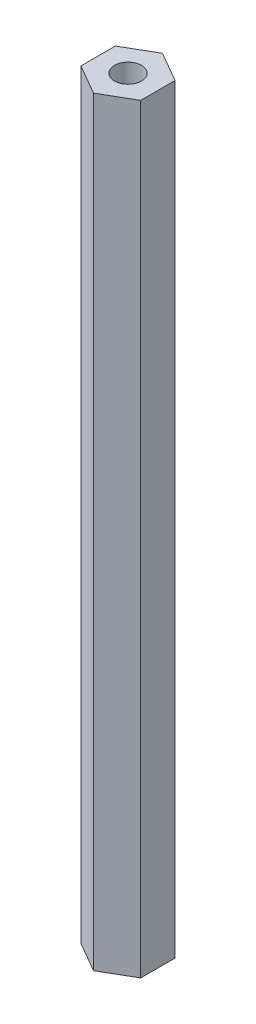
ISO-10303-21;
HEADER;
FILE_DESCRIPTION(('STEP AP214'),'2;1');
FILE_NAME('part.step','',(''),(''),'','','');
FILE_SCHEMA(('AUTOMOTIVE_DESIGN { 1 0 10303 214 1 1 1 1 }'));
ENDSEC;
DATA;
#1=APPLICATION_CONTEXT('core data for automotive mechanical design processes');
#2=APPLICATION_PROTOCOL_DEFINITION('international standard','automotive_design',2000,#1);
#3=PRODUCT_CONTEXT('',#1,'mechanical');
#4=PRODUCT('Part','Part','',(#3));
#5=PRODUCT_RELATED_PRODUCT_CATEGORY('part','',(#4));
#6=PRODUCT_DEFINITION_FORMATION('','',#4);
#7=PRODUCT_DEFINITION_CONTEXT('part definition',#1,'design');
#8=PRODUCT_DEFINITION('design','',#6,#7);
#9=PRODUCT_DEFINITION_SHAPE('','',#8);
#10=(LENGTH_UNIT() NAMED_UNIT(*) SI_UNIT(.MILLI.,.METRE.));
#11=(NAMED_UNIT(*) PLANE_ANGLE_UNIT() SI_UNIT($,.RADIAN.));
#12=(NAMED_UNIT(*) SI_UNIT($,.STERADIAN.) SOLID_ANGLE_UNIT());
#13=UNCERTAINTY_MEASURE_WITH_UNIT(LENGTH_MEASURE(1.E-05),#10,'distance_accuracy_value','');
#14=(GEOMETRIC_REPRESENTATION_CONTEXT(3) GLOBAL_UNCERTAINTY_ASSIGNED_CONTEXT((#13)) GLOBAL_UNIT_ASSIGNED_CONTEXT((#10,
#11,#12)) REPRESENTATION_CONTEXT('',''));
#15=CARTESIAN_POINT('',(0.,0.,0.));
#16=DIRECTION('',(0.,0.,1.));
#17=DIRECTION('',(1.,0.,0.));
#18=AXIS2_PLACEMENT_3D('',#15,#16,#17);
#19=CARTESIAN_POINT('',(0.,70.,-3.17542648054294));
#20=DIRECTION('',(0.5,0.,0.866025403784439));
#21=DIRECTION('',(0.866025403784439,0.,-0.5));
#22=AXIS2_PLACEMENT_3D('',#19,#20,#21);
#23=PLANE('',#22);
#24=DIRECTION('',(-0.866025403784439,0.,0.5));
#25=VECTOR('',#24,1.);
#26=CARTESIAN_POINT('',(0.,0.,-3.17542648054294));
#27=LINE('',#26,#25);
#28=CARTESIAN_POINT('',(0.,0.,-3.17542648054294));
#29=VERTEX_POINT('',#28);
#30=CARTESIAN_POINT('',(-2.75,0.,-1.58771324027147));
#31=VERTEX_POINT('',#30);
#32=EDGE_CURVE('E138',#29,#31,#27,.T.);
#33=ORIENTED_EDGE('',*,*,#32,.T.);
#34=DIRECTION('',(0.,-1.,0.));
#35=VECTOR('',#34,1.);
#36=CARTESIAN_POINT('',(-2.75,70.,-1.58771324027147));
#37=LINE('',#36,#35);
#38=CARTESIAN_POINT('',(-2.75,70.,-1.58771324027147));
#39=VERTEX_POINT('',#38);
#40=EDGE_CURVE('E11',#39,#31,#37,.T.);
#41=ORIENTED_EDGE('',*,*,#40,.F.);
#42=DIRECTION('',(-0.866025403784439,0.,0.5));
#43=VECTOR('',#42,1.);
#44=CARTESIAN_POINT('',(0.,70.,-3.17542648054294));
#45=LINE('',#44,#43);
#46=CARTESIAN_POINT('',(0.,70.,-3.17542648054294));
#47=VERTEX_POINT('',#46);
#48=EDGE_CURVE('E149',#47,#39,#45,.T.);
#49=ORIENTED_EDGE('',*,*,#48,.F.);
#50=DIRECTION('',(0.,-1.,0.));
#51=VECTOR('',#50,1.);
#52=CARTESIAN_POINT('',(0.,70.,-3.17542648054294));
#53=LINE('',#52,#51);
#54=EDGE_CURVE('E134',#47,#29,#53,.T.);
#55=ORIENTED_EDGE('',*,*,#54,.T.);
#56=EDGE_LOOP('',(#33,#41,#49,#55));
#57=FACE_BOUND('',#56,.T.);
#58=ADVANCED_FACE('F51',(#57),#23,.F.);
#59=CARTESIAN_POINT('',(-2.75,70.,-1.58771324027147));
#60=DIRECTION('',(1.,0.,0.));
#61=DIRECTION('',(0.,0.,-1.));
#62=AXIS2_PLACEMENT_3D('',#59,#60,#61);
#63=PLANE('',#62);
#64=DIRECTION('',(0.,0.,1.));
#65=VECTOR('',#64,1.);
#66=CARTESIAN_POINT('',(-2.75,0.,-1.58771324027147));
#67=LINE('',#66,#65);
#68=CARTESIAN_POINT('',(-2.75,0.,1.58771324027147));
#69=VERTEX_POINT('',#68);
#70=EDGE_CURVE('E141',#31,#69,#67,.T.);
#71=ORIENTED_EDGE('',*,*,#70,.T.);
#72=DIRECTION('',(0.,-1.,0.));
#73=VECTOR('',#72,1.);
#74=CARTESIAN_POINT('',(-2.75,70.,1.58771324027147));
#75=LINE('',#74,#73);
#76=CARTESIAN_POINT('',(-2.75,70.,1.58771324027147));
#77=VERTEX_POINT('',#76);
#78=EDGE_CURVE('E59',#77,#69,#75,.T.);
#79=ORIENTED_EDGE('',*,*,#78,.F.);
#80=DIRECTION('',(0.,0.,1.));
#81=VECTOR('',#80,1.);
#82=CARTESIAN_POINT('',(-2.75,70.,-1.58771324027147));
#83=LINE('',#82,#81);
#84=EDGE_CURVE('E105',#39,#77,#83,.T.);
#85=ORIENTED_EDGE('',*,*,#84,.F.);
#86=ORIENTED_EDGE('',*,*,#40,.T.);
#87=EDGE_LOOP('',(#71,#79,#85,#86));
#88=FACE_BOUND('',#87,.T.);
#89=ADVANCED_FACE('F175',(#88),#63,.F.);
#90=CARTESIAN_POINT('',(-2.75,70.,1.58771324027147));
#91=DIRECTION('',(0.5,0.,-0.866025403784439));
#92=DIRECTION('',(-0.866025403784439,0.,-0.5));
#93=AXIS2_PLACEMENT_3D('',#90,#91,#92);
#94=PLANE('',#93);
#95=DIRECTION('',(0.866025403784439,0.,0.5));
#96=VECTOR('',#95,1.);
#97=CARTESIAN_POINT('',(-2.75,0.,1.58771324027147));
#98=LINE('',#97,#96);
#99=CARTESIAN_POINT('',(0.,0.,3.17542648054294));
#100=VERTEX_POINT('',#99);
#101=EDGE_CURVE('E144',#69,#100,#98,.T.);
#102=ORIENTED_EDGE('',*,*,#101,.T.);
#103=DIRECTION('',(0.,-1.,0.));
#104=VECTOR('',#103,1.);
#105=CARTESIAN_POINT('',(0.,70.,3.17542648054294));
#106=LINE('',#105,#104);
#107=CARTESIAN_POINT('',(0.,70.,3.17542648054294));
#108=VERTEX_POINT('',#107);
#109=EDGE_CURVE('E129',#108,#100,#106,.T.);
#110=ORIENTED_EDGE('',*,*,#109,.F.);
#111=DIRECTION('',(0.866025403784439,0.,0.5));
#112=VECTOR('',#111,1.);
#113=CARTESIAN_POINT('',(-2.75,70.,1.58771324027147));
#114=LINE('',#113,#112);
#115=EDGE_CURVE('E120',#77,#108,#114,.T.);
#116=ORIENTED_EDGE('',*,*,#115,.F.);
#117=ORIENTED_EDGE('',*,*,#78,.T.);
#118=EDGE_LOOP('',(#102,#110,#116,#117));
#119=FACE_BOUND('',#118,.T.);
#120=ADVANCED_FACE('F155',(#119),#94,.F.);
#121=CARTESIAN_POINT('',(0.,70.,3.17542648054294));
#122=DIRECTION('',(-0.5,0.,-0.866025403784439));
#123=DIRECTION('',(-0.866025403784439,0.,0.5));
#124=AXIS2_PLACEMENT_3D('',#121,#122,#123);
#125=PLANE('',#124);
#126=DIRECTION('',(0.866025403784439,0.,-0.5));
#127=VECTOR('',#126,1.);
#128=CARTESIAN_POINT('',(0.,0.,3.17542648054294));
#129=LINE('',#128,#127);
#130=CARTESIAN_POINT('',(2.75,0.,1.58771324027147));
#131=VERTEX_POINT('',#130);
#132=EDGE_CURVE('E128',#100,#131,#129,.T.);
#133=ORIENTED_EDGE('',*,*,#132,.T.);
#134=DIRECTION('',(0.,-1.,0.));
#135=VECTOR('',#134,1.);
#136=CARTESIAN_POINT('',(2.75,70.,1.58771324027147));
#137=LINE('',#136,#135);
#138=CARTESIAN_POINT('',(2.75,70.,1.58771324027147));
#139=VERTEX_POINT('',#138);
#140=EDGE_CURVE('E125',#139,#131,#137,.T.);
#141=ORIENTED_EDGE('',*,*,#140,.F.);
#142=DIRECTION('',(0.866025403784439,0.,-0.5));
#143=VECTOR('',#142,1.);
#144=CARTESIAN_POINT('',(0.,70.,3.17542648054294));
#145=LINE('',#144,#143);
#146=EDGE_CURVE('E114',#108,#139,#145,.T.);
#147=ORIENTED_EDGE('',*,*,#146,.F.);
#148=ORIENTED_EDGE('',*,*,#109,.T.);
#149=EDGE_LOOP('',(#133,#141,#147,#148));
#150=FACE_BOUND('',#149,.T.);
#151=ADVANCED_FACE('F126',(#150),#125,.F.);
#152=CARTESIAN_POINT('',(2.75,70.,1.58771324027147));
#153=DIRECTION('',(-1.,0.,0.));
#154=DIRECTION('',(0.,0.,1.));
#155=AXIS2_PLACEMENT_3D('',#152,#153,#154);
#156=PLANE('',#155);
#157=DIRECTION('',(0.,0.,-1.));
#158=VECTOR('',#157,1.);
#159=CARTESIAN_POINT('',(2.75,0.,1.58771324027147));
#160=LINE('',#159,#158);
#161=CARTESIAN_POINT('',(2.75,0.,-1.58771324027147));
#162=VERTEX_POINT('',#161);
#163=EDGE_CURVE('E91',#131,#162,#160,.T.);
#164=ORIENTED_EDGE('',*,*,#163,.T.);
#165=DIRECTION('',(0.,-1.,0.));
#166=VECTOR('',#165,1.);
#167=CARTESIAN_POINT('',(2.75,70.,-1.58771324027147));
#168=LINE('',#167,#166);
#169=CARTESIAN_POINT('',(2.75,70.,-1.58771324027147));
#170=VERTEX_POINT('',#169);
#171=EDGE_CURVE('E130',#170,#162,#168,.T.);
#172=ORIENTED_EDGE('',*,*,#171,.F.);
#173=DIRECTION('',(0.,0.,-1.));
#174=VECTOR('',#173,1.);
#175=CARTESIAN_POINT('',(2.75,70.,1.58771324027147));
#176=LINE('',#175,#174);
#177=EDGE_CURVE('E118',#139,#170,#176,.T.);
#178=ORIENTED_EDGE('',*,*,#177,.F.);
#179=ORIENTED_EDGE('',*,*,#140,.T.);
#180=EDGE_LOOP('',(#164,#172,#178,#179));
#181=FACE_BOUND('',#180,.T.);
#182=ADVANCED_FACE('F132',(#181),#156,.F.);
#183=CARTESIAN_POINT('',(2.75,70.,-1.58771324027147));
#184=DIRECTION('',(-0.5,0.,0.866025403784439));
#185=DIRECTION('',(0.866025403784439,0.,0.5));
#186=AXIS2_PLACEMENT_3D('',#183,#184,#185);
#187=PLANE('',#186);
#188=DIRECTION('',(-0.866025403784439,0.,-0.5));
#189=VECTOR('',#188,1.);
#190=CARTESIAN_POINT('',(2.75,0.,-1.58771324027147));
#191=LINE('',#190,#189);
#192=EDGE_CURVE('E97',#162,#29,#191,.T.);
#193=ORIENTED_EDGE('',*,*,#192,.T.);
#194=ORIENTED_EDGE('',*,*,#54,.F.);
#195=DIRECTION('',(-0.866025403784439,0.,-0.5));
#196=VECTOR('',#195,1.);
#197=CARTESIAN_POINT('',(2.75,70.,-1.58771324027147));
#198=LINE('',#197,#196);
#199=EDGE_CURVE('E67',#170,#47,#198,.T.);
#200=ORIENTED_EDGE('',*,*,#199,.F.);
#201=ORIENTED_EDGE('',*,*,#171,.T.);
#202=EDGE_LOOP('',(#193,#194,#200,#201));
#203=FACE_BOUND('',#202,.T.);
#204=ADVANCED_FACE('F162',(#203),#187,.F.);
#205=CARTESIAN_POINT('',(0.,70.,0.));
#206=DIRECTION('',(0.,1.,0.));
#207=DIRECTION('',(0.,0.,1.));
#208=AXIS2_PLACEMENT_3D('',#205,#206,#207);
#209=PLANE('',#208);
#210=CARTESIAN_POINT('',(0.,70.,0.));
#211=DIRECTION('',(0.,1.,0.));
#212=DIRECTION('',(0.,0.,1.));
#213=AXIS2_PLACEMENT_3D('',#210,#211,#212);
#214=CIRCLE('',#213,1.24999999999999);
#215=CARTESIAN_POINT('',(0.,70.,1.24999999999999));
#216=VERTEX_POINT('',#215);
#217=EDGE_CURVE('E291',#216,#216,#214,.T.);
#218=ORIENTED_EDGE('',*,*,#217,.F.);
#219=EDGE_LOOP('',(#218));
#220=FACE_BOUND('',#219,.T.);
#221=ORIENTED_EDGE('',*,*,#48,.T.);
#222=ORIENTED_EDGE('',*,*,#84,.T.);
#223=ORIENTED_EDGE('',*,*,#115,.T.);
#224=ORIENTED_EDGE('',*,*,#146,.T.);
#225=ORIENTED_EDGE('',*,*,#177,.T.);
#226=ORIENTED_EDGE('',*,*,#199,.T.);
#227=EDGE_LOOP('',(#221,#222,#223,#224,#225,#226));
#228=FACE_BOUND('',#227,.T.);
#229=ADVANCED_FACE('F116',(#220,#228),#209,.T.);
#230=CARTESIAN_POINT('',(0.,0.,0.));
#231=DIRECTION('',(0.,1.,0.));
#232=DIRECTION('',(0.,0.,1.));
#233=AXIS2_PLACEMENT_3D('',#230,#231,#232);
#234=PLANE('',#233);
#235=CARTESIAN_POINT('',(0.,0.,0.));
#236=DIRECTION('',(0.,-1.,0.));
#237=DIRECTION('',(0.,0.,-1.));
#238=AXIS2_PLACEMENT_3D('',#235,#236,#237);
#239=CIRCLE('',#238,1.25);
#240=CARTESIAN_POINT('',(0.,0.,-1.25));
#241=VERTEX_POINT('',#240);
#242=EDGE_CURVE('E293',#241,#241,#239,.T.);
#243=ORIENTED_EDGE('',*,*,#242,.F.);
#244=EDGE_LOOP('',(#243));
#245=FACE_BOUND('',#244,.T.);
#246=ORIENTED_EDGE('',*,*,#32,.F.);
#247=ORIENTED_EDGE('',*,*,#192,.F.);
#248=ORIENTED_EDGE('',*,*,#163,.F.);
#249=ORIENTED_EDGE('',*,*,#132,.F.);
#250=ORIENTED_EDGE('',*,*,#101,.F.);
#251=ORIENTED_EDGE('',*,*,#70,.F.);
#252=EDGE_LOOP('',(#246,#247,#248,#249,#250,#251));
#253=FACE_BOUND('',#252,.T.);
#254=ADVANCED_FACE('F158',(#245,#253),#234,.F.);
#255=CARTESIAN_POINT('',(0.,7.5,0.));
#256=DIRECTION('',(0.,-1.,0.));
#257=DIRECTION('',(0.,0.,-1.));
#258=AXIS2_PLACEMENT_3D('',#255,#256,#257);
#259=CONICAL_SURFACE('',#258,1.25,1.02974425867665);
#260=CARTESIAN_POINT('',(0.,8.25107577378445,0.));
#261=VERTEX_POINT('',#260);
#262=VERTEX_LOOP('',#261);
#263=FACE_BOUND('',#262,.T.);
#264=CARTESIAN_POINT('',(0.,7.5,0.));
#265=DIRECTION('',(0.,-1.,0.));
#266=DIRECTION('',(0.,0.,-1.));
#267=AXIS2_PLACEMENT_3D('',#264,#265,#266);
#268=CIRCLE('',#267,1.25);
#269=CARTESIAN_POINT('',(0.,7.5,-1.25));
#270=VERTEX_POINT('',#269);
#271=EDGE_CURVE('E142',#270,#270,#268,.T.);
#272=ORIENTED_EDGE('',*,*,#271,.T.);
#273=EDGE_LOOP('',(#272));
#274=FACE_BOUND('',#273,.T.);
#275=ADVANCED_FACE('F218',(#263,#274),#259,.F.);
#276=CARTESIAN_POINT('',(0.,0.,0.));
#277=DIRECTION('',(0.,-1.,0.));
#278=DIRECTION('',(0.,0.,-1.));
#279=AXIS2_PLACEMENT_3D('',#276,#277,#278);
#280=CYLINDRICAL_SURFACE('',#279,1.25);
#281=ORIENTED_EDGE('',*,*,#271,.F.);
#282=EDGE_LOOP('',(#281));
#283=FACE_BOUND('',#282,.T.);
#284=ORIENTED_EDGE('',*,*,#242,.T.);
#285=EDGE_LOOP('',(#284));
#286=FACE_BOUND('',#285,.T.);
#287=ADVANCED_FACE('F228',(#283,#286),#280,.F.);
#288=CARTESIAN_POINT('',(0.,62.5,0.));
#289=DIRECTION('',(0.,1.,0.));
#290=DIRECTION('',(0.,0.,1.));
#291=AXIS2_PLACEMENT_3D('',#288,#289,#290);
#292=CONICAL_SURFACE('',#291,1.24999999999999,1.02974425867665);
#293=CARTESIAN_POINT('',(0.,61.7489242262156,0.));
#294=VERTEX_POINT('',#293);
#295=VERTEX_LOOP('',#294);
#296=FACE_BOUND('',#295,.T.);
#297=CARTESIAN_POINT('',(0.,62.5,0.));
#298=DIRECTION('',(0.,1.,0.));
#299=DIRECTION('',(0.,0.,1.));
#300=AXIS2_PLACEMENT_3D('',#297,#298,#299);
#301=CIRCLE('',#300,1.24999999999999);
#302=CARTESIAN_POINT('',(0.,62.5,1.24999999999999));
#303=VERTEX_POINT('',#302);
#304=EDGE_CURVE('E288',#303,#303,#301,.T.);
#305=ORIENTED_EDGE('',*,*,#304,.T.);
#306=EDGE_LOOP('',(#305));
#307=FACE_BOUND('',#306,.T.);
#308=ADVANCED_FACE('F238',(#296,#307),#292,.F.);
#309=CARTESIAN_POINT('',(0.,70.,0.));
#310=DIRECTION('',(0.,1.,0.));
#311=DIRECTION('',(0.,0.,1.));
#312=AXIS2_PLACEMENT_3D('',#309,#310,#311);
#313=CYLINDRICAL_SURFACE('',#312,1.24999999999999);
#314=ORIENTED_EDGE('',*,*,#304,.F.);
#315=EDGE_LOOP('',(#314));
#316=FACE_BOUND('',#315,.T.);
#317=ORIENTED_EDGE('',*,*,#217,.T.);
#318=EDGE_LOOP('',(#317));
#319=FACE_BOUND('',#318,.T.);
#320=ADVANCED_FACE('F248',(#316,#319),#313,.F.);
#321=CLOSED_SHELL('',(#58,#89,#120,#151,#182,#204,#229,#254,#275,#287,#308,#320));
#322=MANIFOLD_SOLID_BREP('B2',#321);
#323=ADVANCED_BREP_SHAPE_REPRESENTATION('',(#18,#322),#14);
#324=SHAPE_DEFINITION_REPRESENTATION(#9,#323);
ENDSEC;
END-ISO-10303-21;
